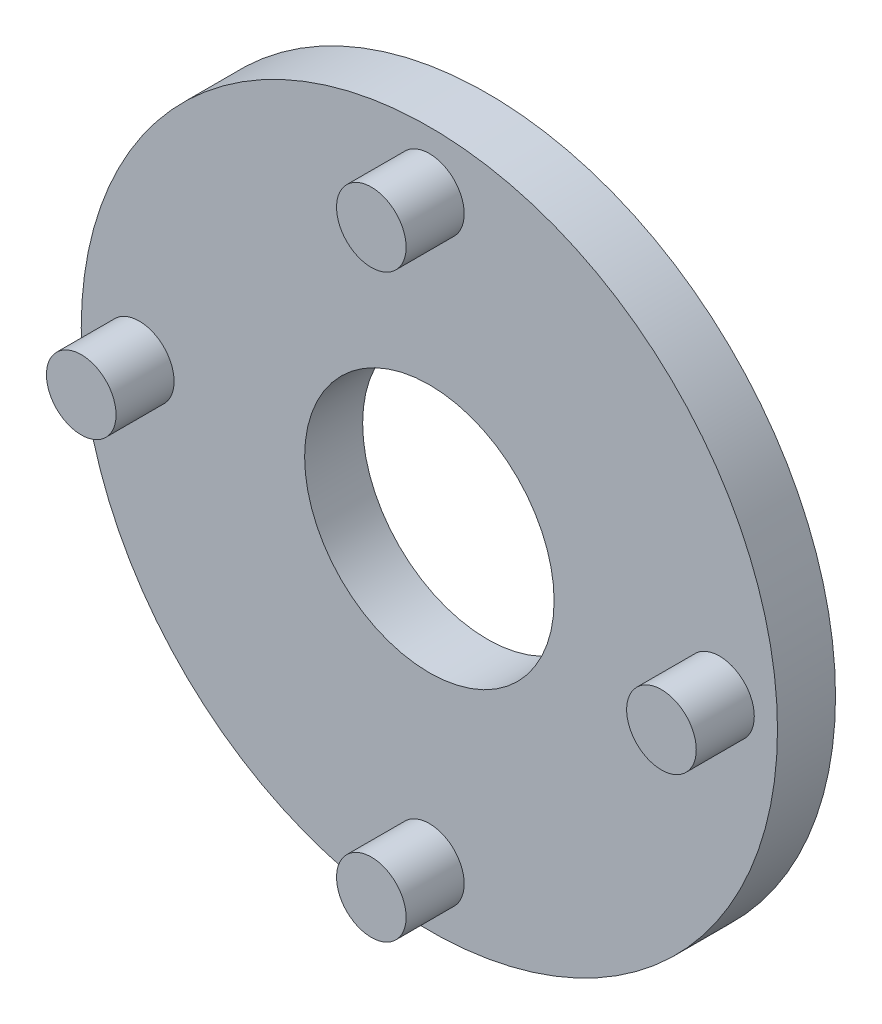
ISO-10303-21;
HEADER;
FILE_DESCRIPTION(('STEP AP214'),'2;1');
FILE_NAME('part.step','',(''),(''),'','','');
FILE_SCHEMA(('AUTOMOTIVE_DESIGN { 1 0 10303 214 1 1 1 1 }'));
ENDSEC;
DATA;
#1=APPLICATION_CONTEXT('core data for automotive mechanical design processes');
#2=APPLICATION_PROTOCOL_DEFINITION('international standard','automotive_design',2000,#1);
#3=PRODUCT_CONTEXT('',#1,'mechanical');
#4=PRODUCT('Part','Part','',(#3));
#5=PRODUCT_RELATED_PRODUCT_CATEGORY('part','',(#4));
#6=PRODUCT_DEFINITION_FORMATION('','',#4);
#7=PRODUCT_DEFINITION_CONTEXT('part definition',#1,'design');
#8=PRODUCT_DEFINITION('design','',#6,#7);
#9=PRODUCT_DEFINITION_SHAPE('','',#8);
#10=(LENGTH_UNIT() NAMED_UNIT(*) SI_UNIT(.MILLI.,.METRE.));
#11=(NAMED_UNIT(*) PLANE_ANGLE_UNIT() SI_UNIT($,.RADIAN.));
#12=(NAMED_UNIT(*) SI_UNIT($,.STERADIAN.) SOLID_ANGLE_UNIT());
#13=UNCERTAINTY_MEASURE_WITH_UNIT(LENGTH_MEASURE(1.E-05),#10,'distance_accuracy_value','');
#14=(GEOMETRIC_REPRESENTATION_CONTEXT(3) GLOBAL_UNCERTAINTY_ASSIGNED_CONTEXT((#13)) GLOBAL_UNIT_ASSIGNED_CONTEXT((#10,
#11,#12)) REPRESENTATION_CONTEXT('',''));
#15=CARTESIAN_POINT('',(0.,0.,0.));
#16=DIRECTION('',(0.,0.,1.));
#17=DIRECTION('',(1.,0.,0.));
#18=AXIS2_PLACEMENT_3D('',#15,#16,#17);
#19=CARTESIAN_POINT('',(0.,0.,-9.99999999999999));
#20=DIRECTION('',(0.,0.,-1.));
#21=DIRECTION('',(-0.97015295309102,-0.242493809423607,0.));
#22=AXIS2_PLACEMENT_3D('',#19,#20,#21);
#23=PLANE('',#22);
#24=CARTESIAN_POINT('',(0.,0.,-9.99999999999999));
#25=DIRECTION('',(0.,0.,-1.));
#26=DIRECTION('',(-1.,0.,0.));
#27=AXIS2_PLACEMENT_3D('',#24,#25,#26);
#28=CIRCLE('',#27,10.75);
#29=CARTESIAN_POINT('',(-10.75,0.,-9.99999999999999));
#30=VERTEX_POINT('',#29);
#31=EDGE_CURVE('E72',#30,#30,#28,.T.);
#32=ORIENTED_EDGE('',*,*,#31,.F.);
#33=EDGE_LOOP('',(#32));
#34=FACE_BOUND('',#33,.T.);
#35=CARTESIAN_POINT('',(0.,0.,-9.99999999999999));
#36=DIRECTION('',(0.,0.,-1.));
#37=DIRECTION('',(-1.,0.,0.));
#38=AXIS2_PLACEMENT_3D('',#35,#36,#37);
#39=CIRCLE('',#38,15.);
#40=CARTESIAN_POINT('',(-15.,0.,-9.99999999999999));
#41=VERTEX_POINT('',#40);
#42=EDGE_CURVE('E82',#41,#41,#39,.T.);
#43=ORIENTED_EDGE('',*,*,#42,.T.);
#44=EDGE_LOOP('',(#43));
#45=FACE_BOUND('',#44,.T.);
#46=ADVANCED_FACE('F33',(#34,#45),#23,.T.);
#47=CARTESIAN_POINT('',(25.,0.,0.));
#48=DIRECTION('',(0.,0.,1.));
#49=DIRECTION('',(1.,0.,0.));
#50=AXIS2_PLACEMENT_3D('',#47,#48,#49);
#51=PLANE('',#50);
#52=CARTESIAN_POINT('',(25.,0.,0.));
#53=DIRECTION('',(0.,0.,1.));
#54=DIRECTION('',(1.,0.,0.));
#55=AXIS2_PLACEMENT_3D('',#52,#53,#54);
#56=CIRCLE('',#55,3.);
#57=CARTESIAN_POINT('',(28.,0.,0.));
#58=VERTEX_POINT('',#57);
#59=EDGE_CURVE('E10',#58,#58,#56,.T.);
#60=ORIENTED_EDGE('',*,*,#59,.T.);
#61=EDGE_LOOP('',(#60));
#62=FACE_BOUND('',#61,.T.);
#63=ADVANCED_FACE('F122',(#62),#51,.T.);
#64=CARTESIAN_POINT('',(25.,0.,-13.4852813742386));
#65=DIRECTION('',(0.,0.,1.));
#66=DIRECTION('',(1.,0.,0.));
#67=AXIS2_PLACEMENT_3D('',#64,#65,#66);
#68=CYLINDRICAL_SURFACE('',#67,3.);
#69=ORIENTED_EDGE('',*,*,#59,.F.);
#70=EDGE_LOOP('',(#69));
#71=FACE_BOUND('',#70,.T.);
#72=CARTESIAN_POINT('',(25.,0.,-5.));
#73=DIRECTION('',(0.,0.,-1.));
#74=DIRECTION('',(-1.,0.,0.));
#75=AXIS2_PLACEMENT_3D('',#72,#73,#74);
#76=CIRCLE('',#75,3.);
#77=CARTESIAN_POINT('',(22.,0.,-5.));
#78=VERTEX_POINT('',#77);
#79=EDGE_CURVE('E37',#78,#78,#76,.F.);
#80=ORIENTED_EDGE('',*,*,#79,.T.);
#81=EDGE_LOOP('',(#80));
#82=FACE_BOUND('',#81,.T.);
#83=ADVANCED_FACE('F35',(#71,#82),#68,.T.);
#84=CARTESIAN_POINT('',(0.,0.,-94.8528137423857));
#85=DIRECTION('',(0.,0.,1.));
#86=DIRECTION('',(1.,0.,0.));
#87=AXIS2_PLACEMENT_3D('',#84,#85,#86);
#88=CYLINDRICAL_SURFACE('',#87,30.);
#89=CARTESIAN_POINT('',(0.,0.,-5.));
#90=DIRECTION('',(0.,0.,-1.));
#91=DIRECTION('',(-1.,0.,0.));
#92=AXIS2_PLACEMENT_3D('',#89,#90,#91);
#93=CIRCLE('',#92,30.);
#94=CARTESIAN_POINT('',(30.,0.,-4.99999999999999));
#95=VERTEX_POINT('',#94);
#96=EDGE_CURVE('E48',#95,#95,#93,.T.);
#97=CARTESIAN_POINT('',(0.,0.,-9.99999999999999));
#98=DIRECTION('',(0.,0.,-1.));
#99=DIRECTION('',(-1.,0.,0.));
#100=AXIS2_PLACEMENT_3D('',#97,#98,#99);
#101=CIRCLE('',#100,30.);
#102=CARTESIAN_POINT('',(30.,0.,-9.99999999999999));
#103=VERTEX_POINT('',#102);
#104=EDGE_CURVE('E44',#103,#103,#101,.T.);
#105=CARTESIAN_POINT('',(30.,0.,-4.99999999999999));
#106=CARTESIAN_POINT('',(30.,0.,-5.05208333333332));
#107=CARTESIAN_POINT('',(30.,0.,-5.10416666666666));
#108=CARTESIAN_POINT('',(30.,0.,-5.20833333333332));
#109=CARTESIAN_POINT('',(30.,0.,-5.26041666666665));
#110=CARTESIAN_POINT('',(30.,0.,-5.36458333333332));
#111=CARTESIAN_POINT('',(30.,0.,-5.41666666666666));
#112=CARTESIAN_POINT('',(30.,0.,-5.52083333333333));
#113=CARTESIAN_POINT('',(30.,0.,-5.57291666666666));
#114=CARTESIAN_POINT('',(30.,0.,-5.67708333333332));
#115=CARTESIAN_POINT('',(30.,0.,-5.72916666666666));
#116=CARTESIAN_POINT('',(30.,0.,-5.83333333333333));
#117=CARTESIAN_POINT('',(30.,0.,-5.88541666666666));
#118=CARTESIAN_POINT('',(30.,0.,-5.98958333333333));
#119=CARTESIAN_POINT('',(30.,0.,-6.04166666666666));
#120=CARTESIAN_POINT('',(30.,0.,-6.14583333333333));
#121=CARTESIAN_POINT('',(30.,0.,-6.19791666666666));
#122=CARTESIAN_POINT('',(30.,0.,-6.30208333333332));
#123=CARTESIAN_POINT('',(30.,0.,-6.35416666666666));
#124=CARTESIAN_POINT('',(30.,0.,-6.45833333333332));
#125=CARTESIAN_POINT('',(30.,0.,-6.51041666666665));
#126=CARTESIAN_POINT('',(30.,0.,-6.61458333333332));
#127=CARTESIAN_POINT('',(30.,0.,-6.66666666666666));
#128=CARTESIAN_POINT('',(30.,0.,-6.77083333333333));
#129=CARTESIAN_POINT('',(30.,0.,-6.82291666666666));
#130=CARTESIAN_POINT('',(30.,0.,-6.92708333333332));
#131=CARTESIAN_POINT('',(30.,0.,-6.97916666666666));
#132=CARTESIAN_POINT('',(30.,0.,-7.08333333333333));
#133=CARTESIAN_POINT('',(30.,0.,-7.13541666666666));
#134=CARTESIAN_POINT('',(30.,0.,-7.23958333333333));
#135=CARTESIAN_POINT('',(30.,0.,-7.29166666666666));
#136=CARTESIAN_POINT('',(30.,0.,-7.39583333333333));
#137=CARTESIAN_POINT('',(30.,0.,-7.44791666666666));
#138=CARTESIAN_POINT('',(30.,0.,-7.55208333333333));
#139=CARTESIAN_POINT('',(30.,0.,-7.60416666666666));
#140=CARTESIAN_POINT('',(30.,0.,-7.70833333333332));
#141=CARTESIAN_POINT('',(30.,0.,-7.76041666666665));
#142=CARTESIAN_POINT('',(30.,0.,-7.86458333333332));
#143=CARTESIAN_POINT('',(30.,0.,-7.91666666666666));
#144=CARTESIAN_POINT('',(30.,0.,-8.02083333333333));
#145=CARTESIAN_POINT('',(30.,0.,-8.07291666666666));
#146=CARTESIAN_POINT('',(30.,0.,-8.17708333333333));
#147=CARTESIAN_POINT('',(30.,0.,-8.22916666666666));
#148=CARTESIAN_POINT('',(30.,0.,-8.33333333333333));
#149=CARTESIAN_POINT('',(30.,0.,-8.38541666666666));
#150=CARTESIAN_POINT('',(30.,0.,-8.48958333333333));
#151=CARTESIAN_POINT('',(30.,0.,-8.54166666666666));
#152=CARTESIAN_POINT('',(30.,0.,-8.64583333333333));
#153=CARTESIAN_POINT('',(30.,0.,-8.69791666666666));
#154=CARTESIAN_POINT('',(30.,0.,-8.80208333333333));
#155=CARTESIAN_POINT('',(30.,0.,-8.85416666666666));
#156=CARTESIAN_POINT('',(30.,0.,-8.95833333333332));
#157=CARTESIAN_POINT('',(30.,0.,-9.01041666666665));
#158=CARTESIAN_POINT('',(30.,0.,-9.11458333333332));
#159=CARTESIAN_POINT('',(30.,0.,-9.16666666666666));
#160=CARTESIAN_POINT('',(30.,0.,-9.27083333333333));
#161=CARTESIAN_POINT('',(30.,0.,-9.32291666666666));
#162=CARTESIAN_POINT('',(30.,0.,-9.42708333333333));
#163=CARTESIAN_POINT('',(30.,0.,-9.47916666666666));
#164=CARTESIAN_POINT('',(30.,0.,-9.58333333333333));
#165=CARTESIAN_POINT('',(30.,0.,-9.63541666666667));
#166=CARTESIAN_POINT('',(30.,0.,-9.73958333333333));
#167=CARTESIAN_POINT('',(30.,0.,-9.79166666666667));
#168=CARTESIAN_POINT('',(30.,0.,-9.89583333333333));
#169=CARTESIAN_POINT('',(30.,0.,-9.94791666666666));
#170=CARTESIAN_POINT('',(30.,0.,-9.99999999999999));
#171=B_SPLINE_CURVE_WITH_KNOTS('',3,(#105,#106,#107,#108,#109,#110,#111,#112,#113,#114,#115,
#116,#117,#118,#119,#120,#121,#122,#123,#124,#125,#126,#127,#128,#129,#130,#131,#132,#133,#134,
#135,#136,#137,#138,#139,#140,#141,#142,#143,#144,#145,#146,#147,#148,#149,#150,#151,#152,#153,
#154,#155,#156,#157,#158,#159,#160,#161,#162,#163,#164,#165,#166,#167,#168,#169,#170),
.UNSPECIFIED.,.F.,.F.,(4,2,2,2,2,2,2,2,2,2,2,2,2,2,2,2,2,2,2,2,2,2,2,2,2,2,2,2,2,2,2,2,4),(0.,
0.156249999999997,0.312499999999993,0.468750000000004,0.625000000000001,0.781249999999997,
0.937500000000008,1.09375,1.25,1.40625,1.56249999999999,1.71875,1.875,2.03125,2.18750000000001,
2.34375000000001,2.5,2.65625,2.8125,2.96875000000001,3.125,3.28125,3.43750000000001,
3.59375000000001,3.75,3.90625,4.0625,4.21875000000001,4.375,4.53125,4.68750000000001,
4.84375000000001,5.),.UNSPECIFIED.);
#172=EDGE_CURVE('BSEAM112',#95,#103,#171,.T.);
#173=ORIENTED_EDGE('',*,*,#96,.T.);
#174=ORIENTED_EDGE('',*,*,#104,.F.);
#175=ORIENTED_EDGE('',*,*,#172,.T.);
#176=ORIENTED_EDGE('',*,*,#172,.F.);
#177=EDGE_LOOP('',(#173,#175,#174,#176));
#178=FACE_BOUND('',#177,.T.);
#179=ADVANCED_FACE('F112',(#178),#88,.T.);
#180=CARTESIAN_POINT('',(0.,0.,-5.));
#181=DIRECTION('',(0.,0.,-1.));
#182=DIRECTION('',(-1.,0.,0.));
#183=AXIS2_PLACEMENT_3D('',#180,#181,#182);
#184=PLANE('',#183);
#185=CARTESIAN_POINT('',(0.,0.,-5.));
#186=DIRECTION('',(0.,0.,-1.));
#187=DIRECTION('',(-1.,0.,0.));
#188=AXIS2_PLACEMENT_3D('',#185,#186,#187);
#189=CIRCLE('',#188,10.75);
#190=CARTESIAN_POINT('',(-10.75,0.,-5.));
#191=VERTEX_POINT('',#190);
#192=EDGE_CURVE('E69',#191,#191,#189,.F.);
#193=ORIENTED_EDGE('',*,*,#192,.F.);
#194=EDGE_LOOP('',(#193));
#195=FACE_BOUND('',#194,.T.);
#196=CARTESIAN_POINT('',(0.,25.,-5.));
#197=DIRECTION('',(0.,0.,-1.));
#198=DIRECTION('',(-1.,0.,0.));
#199=AXIS2_PLACEMENT_3D('',#196,#197,#198);
#200=CIRCLE('',#199,3.);
#201=CARTESIAN_POINT('',(-3.,25.,-5.));
#202=VERTEX_POINT('',#201);
#203=EDGE_CURVE('E63',#202,#202,#200,.F.);
#204=ORIENTED_EDGE('',*,*,#203,.F.);
#205=EDGE_LOOP('',(#204));
#206=FACE_BOUND('',#205,.T.);
#207=CARTESIAN_POINT('',(-25.,0.,-5.));
#208=DIRECTION('',(0.,0.,-1.));
#209=DIRECTION('',(-1.,0.,0.));
#210=AXIS2_PLACEMENT_3D('',#207,#208,#209);
#211=CIRCLE('',#210,3.);
#212=CARTESIAN_POINT('',(-28.,0.,-5.));
#213=VERTEX_POINT('',#212);
#214=EDGE_CURVE('E57',#213,#213,#211,.F.);
#215=ORIENTED_EDGE('',*,*,#214,.F.);
#216=EDGE_LOOP('',(#215));
#217=FACE_BOUND('',#216,.T.);
#218=CARTESIAN_POINT('',(0.,-25.,-5.));
#219=DIRECTION('',(0.,0.,-1.));
#220=DIRECTION('',(-1.,0.,0.));
#221=AXIS2_PLACEMENT_3D('',#218,#219,#220);
#222=CIRCLE('',#221,3.);
#223=CARTESIAN_POINT('',(-3.,-25.,-5.));
#224=VERTEX_POINT('',#223);
#225=EDGE_CURVE('E51',#224,#224,#222,.F.);
#226=ORIENTED_EDGE('',*,*,#225,.F.);
#227=EDGE_LOOP('',(#226));
#228=FACE_BOUND('',#227,.T.);
#229=ORIENTED_EDGE('',*,*,#79,.F.);
#230=EDGE_LOOP('',(#229));
#231=FACE_BOUND('',#230,.T.);
#232=ORIENTED_EDGE('',*,*,#96,.F.);
#233=EDGE_LOOP('',(#232));
#234=FACE_BOUND('',#233,.T.);
#235=ADVANCED_FACE('F108',(#195,#206,#217,#228,#231,#234),#184,.F.);
#236=CARTESIAN_POINT('',(0.,0.,-9.99999999999999));
#237=DIRECTION('',(0.,0.,-1.));
#238=DIRECTION('',(-1.,0.,0.));
#239=AXIS2_PLACEMENT_3D('',#236,#237,#238);
#240=CIRCLE('',#239,17.);
#241=CARTESIAN_POINT('',(-17.,0.,-9.99999999999999));
#242=VERTEX_POINT('',#241);
#243=EDGE_CURVE('E76',#242,#242,#240,.T.);
#244=ORIENTED_EDGE('',*,*,#243,.F.);
#245=EDGE_LOOP('',(#244));
#246=FACE_BOUND('',#245,.T.);
#247=ORIENTED_EDGE('',*,*,#104,.T.);
#248=EDGE_LOOP('',(#247));
#249=FACE_BOUND('',#248,.T.);
#250=ADVANCED_FACE('F104',(#246,#249),#23,.T.);
#251=CARTESIAN_POINT('',(0.,-25.,0.));
#252=DIRECTION('',(0.,0.,1.));
#253=DIRECTION('',(1.,0.,0.));
#254=AXIS2_PLACEMENT_3D('',#251,#252,#253);
#255=PLANE('',#254);
#256=CARTESIAN_POINT('',(0.,-25.,0.));
#257=DIRECTION('',(0.,0.,1.));
#258=DIRECTION('',(1.,0.,0.));
#259=AXIS2_PLACEMENT_3D('',#256,#257,#258);
#260=CIRCLE('',#259,3.);
#261=CARTESIAN_POINT('',(3.,-25.,0.));
#262=VERTEX_POINT('',#261);
#263=EDGE_CURVE('E54',#262,#262,#260,.T.);
#264=ORIENTED_EDGE('',*,*,#263,.T.);
#265=EDGE_LOOP('',(#264));
#266=FACE_BOUND('',#265,.T.);
#267=ADVANCED_FACE('F107',(#266),#255,.T.);
#268=CARTESIAN_POINT('',(0.,-25.,-13.4852813742386));
#269=DIRECTION('',(0.,0.,1.));
#270=DIRECTION('',(1.,0.,0.));
#271=AXIS2_PLACEMENT_3D('',#268,#269,#270);
#272=CYLINDRICAL_SURFACE('',#271,3.);
#273=ORIENTED_EDGE('',*,*,#263,.F.);
#274=EDGE_LOOP('',(#273));
#275=FACE_BOUND('',#274,.T.);
#276=ORIENTED_EDGE('',*,*,#225,.T.);
#277=EDGE_LOOP('',(#276));
#278=FACE_BOUND('',#277,.T.);
#279=ADVANCED_FACE('F152',(#275,#278),#272,.T.);
#280=CARTESIAN_POINT('',(-25.,0.,0.));
#281=DIRECTION('',(0.,0.,1.));
#282=DIRECTION('',(1.,0.,0.));
#283=AXIS2_PLACEMENT_3D('',#280,#281,#282);
#284=PLANE('',#283);
#285=CARTESIAN_POINT('',(-25.,0.,0.));
#286=DIRECTION('',(0.,0.,1.));
#287=DIRECTION('',(1.,0.,0.));
#288=AXIS2_PLACEMENT_3D('',#285,#286,#287);
#289=CIRCLE('',#288,3.);
#290=CARTESIAN_POINT('',(-22.,0.,0.));
#291=VERTEX_POINT('',#290);
#292=EDGE_CURVE('E60',#291,#291,#289,.T.);
#293=ORIENTED_EDGE('',*,*,#292,.T.);
#294=EDGE_LOOP('',(#293));
#295=FACE_BOUND('',#294,.T.);
#296=ADVANCED_FACE('F149',(#295),#284,.T.);
#297=CARTESIAN_POINT('',(-25.,0.,-13.4852813742386));
#298=DIRECTION('',(0.,0.,1.));
#299=DIRECTION('',(1.,0.,0.));
#300=AXIS2_PLACEMENT_3D('',#297,#298,#299);
#301=CYLINDRICAL_SURFACE('',#300,3.);
#302=ORIENTED_EDGE('',*,*,#292,.F.);
#303=EDGE_LOOP('',(#302));
#304=FACE_BOUND('',#303,.T.);
#305=ORIENTED_EDGE('',*,*,#214,.T.);
#306=EDGE_LOOP('',(#305));
#307=FACE_BOUND('',#306,.T.);
#308=ADVANCED_FACE('F144',(#304,#307),#301,.T.);
#309=CARTESIAN_POINT('',(0.,25.,0.));
#310=DIRECTION('',(0.,0.,1.));
#311=DIRECTION('',(1.,0.,0.));
#312=AXIS2_PLACEMENT_3D('',#309,#310,#311);
#313=PLANE('',#312);
#314=CARTESIAN_POINT('',(0.,25.,0.));
#315=DIRECTION('',(0.,0.,1.));
#316=DIRECTION('',(1.,0.,0.));
#317=AXIS2_PLACEMENT_3D('',#314,#315,#316);
#318=CIRCLE('',#317,3.);
#319=CARTESIAN_POINT('',(3.,25.,0.));
#320=VERTEX_POINT('',#319);
#321=EDGE_CURVE('E66',#320,#320,#318,.T.);
#322=ORIENTED_EDGE('',*,*,#321,.T.);
#323=EDGE_LOOP('',(#322));
#324=FACE_BOUND('',#323,.T.);
#325=ADVANCED_FACE('F141',(#324),#313,.T.);
#326=CARTESIAN_POINT('',(0.,25.,-13.4852813742386));
#327=DIRECTION('',(0.,0.,1.));
#328=DIRECTION('',(1.,0.,0.));
#329=AXIS2_PLACEMENT_3D('',#326,#327,#328);
#330=CYLINDRICAL_SURFACE('',#329,3.);
#331=ORIENTED_EDGE('',*,*,#321,.F.);
#332=EDGE_LOOP('',(#331));
#333=FACE_BOUND('',#332,.T.);
#334=ORIENTED_EDGE('',*,*,#203,.T.);
#335=EDGE_LOOP('',(#334));
#336=FACE_BOUND('',#335,.T.);
#337=ADVANCED_FACE('F139',(#333,#336),#330,.T.);
#338=CARTESIAN_POINT('',(0.,0.,25.4055915910215));
#339=DIRECTION('',(0.,0.,-1.));
#340=DIRECTION('',(-1.,0.,0.));
#341=AXIS2_PLACEMENT_3D('',#338,#339,#340);
#342=CYLINDRICAL_SURFACE('',#341,10.75);
#343=ORIENTED_EDGE('',*,*,#192,.T.);
#344=EDGE_LOOP('',(#343));
#345=FACE_BOUND('',#344,.T.);
#346=ORIENTED_EDGE('',*,*,#31,.T.);
#347=EDGE_LOOP('',(#346));
#348=FACE_BOUND('',#347,.T.);
#349=ADVANCED_FACE('F100',(#345,#348),#342,.F.);
#350=CARTESIAN_POINT('',(0.,0.,-6.99999999999999));
#351=DIRECTION('',(0.,0.,-1.));
#352=DIRECTION('',(-1.,0.,0.));
#353=AXIS2_PLACEMENT_3D('',#350,#351,#352);
#354=CYLINDRICAL_SURFACE('',#353,17.);
#355=CARTESIAN_POINT('',(0.,0.,-6.99999999999999));
#356=DIRECTION('',(0.,0.,-1.));
#357=DIRECTION('',(-1.,0.,0.));
#358=AXIS2_PLACEMENT_3D('',#355,#356,#357);
#359=CIRCLE('',#358,17.);
#360=CARTESIAN_POINT('',(-17.,0.,-6.99999999999999));
#361=VERTEX_POINT('',#360);
#362=EDGE_CURVE('E75',#361,#361,#359,.T.);
#363=ORIENTED_EDGE('',*,*,#362,.F.);
#364=EDGE_LOOP('',(#363));
#365=FACE_BOUND('',#364,.T.);
#366=ORIENTED_EDGE('',*,*,#243,.T.);
#367=EDGE_LOOP('',(#366));
#368=FACE_BOUND('',#367,.T.);
#369=ADVANCED_FACE('F94',(#365,#368),#354,.F.);
#370=CARTESIAN_POINT('',(0.,0.,-6.99999999999999));
#371=DIRECTION('',(0.,0.,-1.));
#372=DIRECTION('',(-1.,0.,0.));
#373=AXIS2_PLACEMENT_3D('',#370,#371,#372);
#374=PLANE('',#373);
#375=CARTESIAN_POINT('',(0.,0.,-6.99999999999999));
#376=DIRECTION('',(0.,0.,-1.));
#377=DIRECTION('',(-1.,0.,0.));
#378=AXIS2_PLACEMENT_3D('',#375,#376,#377);
#379=CIRCLE('',#378,15.);
#380=CARTESIAN_POINT('',(-15.,0.,-6.99999999999999));
#381=VERTEX_POINT('',#380);
#382=EDGE_CURVE('E79',#381,#381,#379,.T.);
#383=ORIENTED_EDGE('',*,*,#382,.F.);
#384=EDGE_LOOP('',(#383));
#385=FACE_BOUND('',#384,.T.);
#386=ORIENTED_EDGE('',*,*,#362,.T.);
#387=EDGE_LOOP('',(#386));
#388=FACE_BOUND('',#387,.T.);
#389=ADVANCED_FACE('F91',(#385,#388),#374,.T.);
#390=CARTESIAN_POINT('',(0.,0.,-6.99999999999999));
#391=DIRECTION('',(0.,0.,-1.));
#392=DIRECTION('',(-1.,0.,0.));
#393=AXIS2_PLACEMENT_3D('',#390,#391,#392);
#394=CYLINDRICAL_SURFACE('',#393,15.);
#395=ORIENTED_EDGE('',*,*,#382,.T.);
#396=EDGE_LOOP('',(#395));
#397=FACE_BOUND('',#396,.T.);
#398=ORIENTED_EDGE('',*,*,#42,.F.);
#399=EDGE_LOOP('',(#398));
#400=FACE_BOUND('',#399,.T.);
#401=ADVANCED_FACE('F88',(#397,#400),#394,.T.);
#402=CLOSED_SHELL('',(#46,#63,#83,#179,#235,#250,#267,#279,#296,#308,#325,#337,#349,#369,#389,#401));
#403=MANIFOLD_SOLID_BREP('B2',#402);
#404=ADVANCED_BREP_SHAPE_REPRESENTATION('',(#18,#403),#14);
#405=SHAPE_DEFINITION_REPRESENTATION(#9,#404);
ENDSEC;
END-ISO-10303-21;
